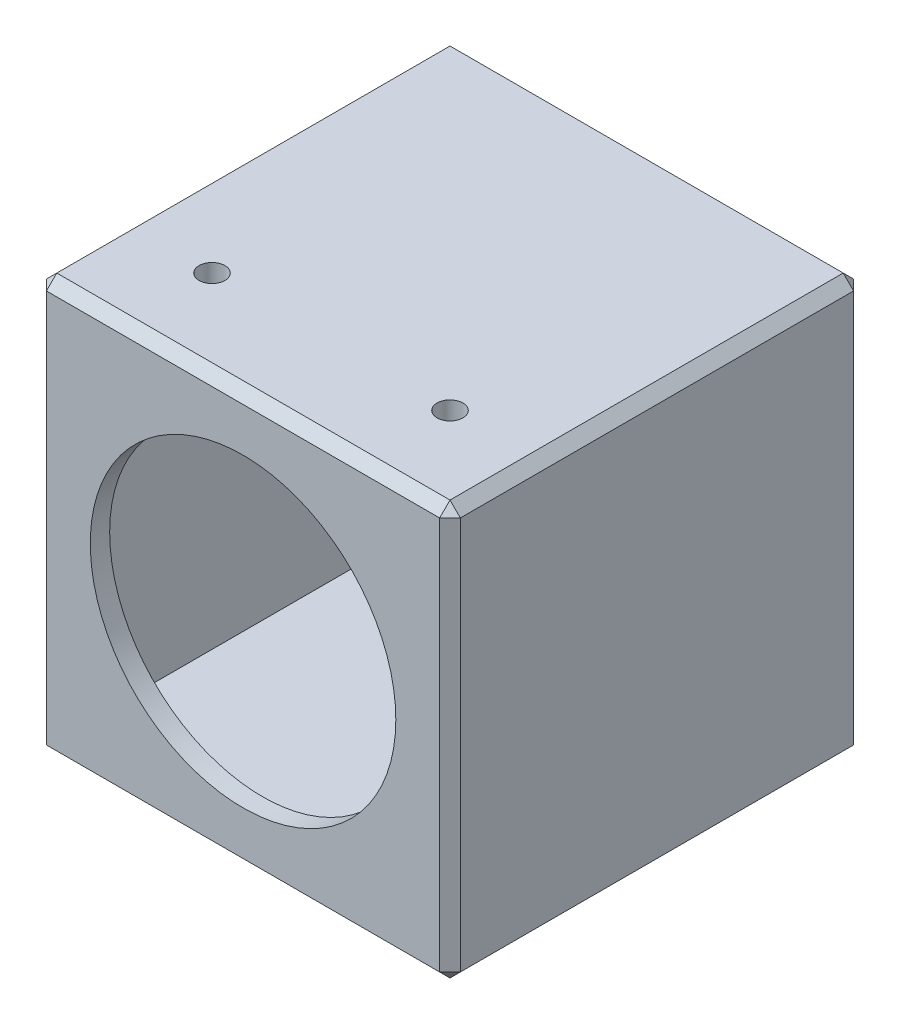
ISO-10303-21;
HEADER;
FILE_DESCRIPTION(('STEP AP214'),'2;1');
FILE_NAME('part.step','',(''),(''),'','','');
FILE_SCHEMA(('AUTOMOTIVE_DESIGN { 1 0 10303 214 1 1 1 1 }'));
ENDSEC;
DATA;
#1=APPLICATION_CONTEXT('core data for automotive mechanical design processes');
#2=APPLICATION_PROTOCOL_DEFINITION('international standard','automotive_design',2000,#1);
#3=PRODUCT_CONTEXT('',#1,'mechanical');
#4=PRODUCT('Part','Part','',(#3));
#5=PRODUCT_RELATED_PRODUCT_CATEGORY('part','',(#4));
#6=PRODUCT_DEFINITION_FORMATION('','',#4);
#7=PRODUCT_DEFINITION_CONTEXT('part definition',#1,'design');
#8=PRODUCT_DEFINITION('design','',#6,#7);
#9=PRODUCT_DEFINITION_SHAPE('','',#8);
#10=(LENGTH_UNIT() NAMED_UNIT(*) SI_UNIT(.MILLI.,.METRE.));
#11=(NAMED_UNIT(*) PLANE_ANGLE_UNIT() SI_UNIT($,.RADIAN.));
#12=(NAMED_UNIT(*) SI_UNIT($,.STERADIAN.) SOLID_ANGLE_UNIT());
#13=UNCERTAINTY_MEASURE_WITH_UNIT(LENGTH_MEASURE(1.E-05),#10,'distance_accuracy_value','');
#14=(GEOMETRIC_REPRESENTATION_CONTEXT(3) GLOBAL_UNCERTAINTY_ASSIGNED_CONTEXT((#13)) GLOBAL_UNIT_ASSIGNED_CONTEXT((#10,
#11,#12)) REPRESENTATION_CONTEXT('',''));
#15=CARTESIAN_POINT('',(0.,0.,0.));
#16=DIRECTION('',(0.,0.,1.));
#17=DIRECTION('',(1.,0.,0.));
#18=AXIS2_PLACEMENT_3D('',#15,#16,#17);
#19=CARTESIAN_POINT('',(-50.8,101.6,-50.8));
#20=DIRECTION('',(1.,0.,0.));
#21=DIRECTION('',(0.,0.,-1.));
#22=AXIS2_PLACEMENT_3D('',#19,#20,#21);
#23=PLANE('',#22);
#24=DIRECTION('',(0.,0.,-1.));
#25=VECTOR('',#24,1.);
#26=CARTESIAN_POINT('',(-50.8,99.06,-50.8));
#27=LINE('',#26,#25);
#28=CARTESIAN_POINT('',(-50.8,99.06,48.26));
#29=VERTEX_POINT('',#28);
#30=CARTESIAN_POINT('',(-50.8,99.06,-48.26));
#31=VERTEX_POINT('',#30);
#32=EDGE_CURVE('E229',#29,#31,#27,.T.);
#33=ORIENTED_EDGE('',*,*,#32,.T.);
#34=DIRECTION('',(0.,-1.,0.));
#35=VECTOR('',#34,1.);
#36=CARTESIAN_POINT('',(-50.8,101.6,-48.26));
#37=LINE('',#36,#35);
#38=CARTESIAN_POINT('',(-50.8,2.53999999999999,-48.26));
#39=VERTEX_POINT('',#38);
#40=EDGE_CURVE('E231',#31,#39,#37,.T.);
#41=ORIENTED_EDGE('',*,*,#40,.T.);
#42=DIRECTION('',(0.,0.,1.));
#43=VECTOR('',#42,1.);
#44=CARTESIAN_POINT('',(-50.8,2.53999999999999,-50.8));
#45=LINE('',#44,#43);
#46=CARTESIAN_POINT('',(-50.8,2.53999999999999,48.26));
#47=VERTEX_POINT('',#46);
#48=EDGE_CURVE('E225',#39,#47,#45,.T.);
#49=ORIENTED_EDGE('',*,*,#48,.T.);
#50=DIRECTION('',(0.,1.,0.));
#51=VECTOR('',#50,1.);
#52=CARTESIAN_POINT('',(-50.8,101.6,48.26));
#53=LINE('',#52,#51);
#54=EDGE_CURVE('E227',#47,#29,#53,.T.);
#55=ORIENTED_EDGE('',*,*,#54,.T.);
#56=EDGE_LOOP('',(#33,#41,#49,#55));
#57=FACE_BOUND('',#56,.T.);
#58=ADVANCED_FACE('F35',(#57),#23,.F.);
#59=CARTESIAN_POINT('',(-50.8,101.6,50.8));
#60=DIRECTION('',(0.,0.,-1.));
#61=DIRECTION('',(-1.,0.,0.));
#62=AXIS2_PLACEMENT_3D('',#59,#60,#61);
#63=PLANE('',#62);
#64=CARTESIAN_POINT('',(0.,50.8,50.8));
#65=DIRECTION('',(0.,0.,1.));
#66=DIRECTION('',(1.,0.,0.));
#67=AXIS2_PLACEMENT_3D('',#64,#65,#66);
#68=CIRCLE('',#67,37.5);
#69=CARTESIAN_POINT('',(37.5,50.8,50.8));
#70=VERTEX_POINT('',#69);
#71=EDGE_CURVE('E171',#70,#70,#68,.T.);
#72=ORIENTED_EDGE('',*,*,#71,.F.);
#73=EDGE_LOOP('',(#72));
#74=FACE_BOUND('',#73,.T.);
#75=DIRECTION('',(-1.,0.,0.));
#76=VECTOR('',#75,1.);
#77=CARTESIAN_POINT('',(-50.8,99.06,50.8));
#78=LINE('',#77,#76);
#79=CARTESIAN_POINT('',(48.26,99.06,50.8));
#80=VERTEX_POINT('',#79);
#81=CARTESIAN_POINT('',(-48.26,99.06,50.8));
#82=VERTEX_POINT('',#81);
#83=EDGE_CURVE('E167',#80,#82,#78,.T.);
#84=ORIENTED_EDGE('',*,*,#83,.T.);
#85=DIRECTION('',(0.,-1.,0.));
#86=VECTOR('',#85,1.);
#87=CARTESIAN_POINT('',(-48.26,101.6,50.8));
#88=LINE('',#87,#86);
#89=CARTESIAN_POINT('',(-48.26,2.53999999999999,50.8));
#90=VERTEX_POINT('',#89);
#91=EDGE_CURVE('E205',#82,#90,#88,.T.);
#92=ORIENTED_EDGE('',*,*,#91,.T.);
#93=DIRECTION('',(1.,0.,0.));
#94=VECTOR('',#93,1.);
#95=CARTESIAN_POINT('',(-50.8,2.53999999999999,50.8));
#96=LINE('',#95,#94);
#97=CARTESIAN_POINT('',(48.26,2.53999999999999,50.8));
#98=VERTEX_POINT('',#97);
#99=EDGE_CURVE('E202',#90,#98,#96,.T.);
#100=ORIENTED_EDGE('',*,*,#99,.T.);
#101=DIRECTION('',(0.,1.,0.));
#102=VECTOR('',#101,1.);
#103=CARTESIAN_POINT('',(48.26,101.6,50.8));
#104=LINE('',#103,#102);
#105=EDGE_CURVE('E197',#98,#80,#104,.T.);
#106=ORIENTED_EDGE('',*,*,#105,.T.);
#107=EDGE_LOOP('',(#84,#92,#100,#106));
#108=FACE_BOUND('',#107,.T.);
#109=ADVANCED_FACE('F342',(#74,#108),#63,.F.);
#110=CARTESIAN_POINT('',(50.8,101.6,-50.8));
#111=DIRECTION('',(-1.,0.,0.));
#112=DIRECTION('',(0.,0.,1.));
#113=AXIS2_PLACEMENT_3D('',#110,#111,#112);
#114=PLANE('',#113);
#115=DIRECTION('',(0.,0.,1.));
#116=VECTOR('',#115,1.);
#117=CARTESIAN_POINT('',(50.8,99.06,50.8));
#118=LINE('',#117,#116);
#119=CARTESIAN_POINT('',(50.8,99.06,-48.26));
#120=VERTEX_POINT('',#119);
#121=CARTESIAN_POINT('',(50.8,99.06,48.26));
#122=VERTEX_POINT('',#121);
#123=EDGE_CURVE('E86',#120,#122,#118,.T.);
#124=ORIENTED_EDGE('',*,*,#123,.T.);
#125=DIRECTION('',(0.,-1.,0.));
#126=VECTOR('',#125,1.);
#127=CARTESIAN_POINT('',(50.8,101.6,48.26));
#128=LINE('',#127,#126);
#129=CARTESIAN_POINT('',(50.8,2.53999999999999,48.26));
#130=VERTEX_POINT('',#129);
#131=EDGE_CURVE('E238',#122,#130,#128,.T.);
#132=ORIENTED_EDGE('',*,*,#131,.T.);
#133=DIRECTION('',(0.,0.,-1.));
#134=VECTOR('',#133,1.);
#135=CARTESIAN_POINT('',(50.8,2.53999999999999,-50.8));
#136=LINE('',#135,#134);
#137=CARTESIAN_POINT('',(50.8,2.53999999999999,-48.26));
#138=VERTEX_POINT('',#137);
#139=EDGE_CURVE('E234',#130,#138,#136,.T.);
#140=ORIENTED_EDGE('',*,*,#139,.T.);
#141=DIRECTION('',(0.,1.,0.));
#142=VECTOR('',#141,1.);
#143=CARTESIAN_POINT('',(50.8,101.6,-48.26));
#144=LINE('',#143,#142);
#145=EDGE_CURVE('E91',#138,#120,#144,.T.);
#146=ORIENTED_EDGE('',*,*,#145,.T.);
#147=EDGE_LOOP('',(#124,#132,#140,#146));
#148=FACE_BOUND('',#147,.T.);
#149=ADVANCED_FACE('F348',(#148),#114,.F.);
#150=CARTESIAN_POINT('',(-50.8,101.6,-50.8));
#151=DIRECTION('',(0.,0.,1.));
#152=DIRECTION('',(1.,0.,0.));
#153=AXIS2_PLACEMENT_3D('',#150,#151,#152);
#154=PLANE('',#153);
#155=DIRECTION('',(0.,1.,0.));
#156=VECTOR('',#155,1.);
#157=CARTESIAN_POINT('',(-48.26,101.6,-50.8));
#158=LINE('',#157,#156);
#159=CARTESIAN_POINT('',(-48.26,2.53999999999999,-50.8));
#160=VERTEX_POINT('',#159);
#161=CARTESIAN_POINT('',(-48.26,99.06,-50.8));
#162=VERTEX_POINT('',#161);
#163=EDGE_CURVE('E220',#160,#162,#158,.T.);
#164=ORIENTED_EDGE('',*,*,#163,.T.);
#165=DIRECTION('',(1.,0.,0.));
#166=VECTOR('',#165,1.);
#167=CARTESIAN_POINT('',(50.8,99.06,-50.8));
#168=LINE('',#167,#166);
#169=CARTESIAN_POINT('',(48.26,99.06,-50.8));
#170=VERTEX_POINT('',#169);
#171=EDGE_CURVE('E222',#162,#170,#168,.T.);
#172=ORIENTED_EDGE('',*,*,#171,.T.);
#173=DIRECTION('',(0.,-1.,0.));
#174=VECTOR('',#173,1.);
#175=CARTESIAN_POINT('',(48.26,101.6,-50.8));
#176=LINE('',#175,#174);
#177=CARTESIAN_POINT('',(48.26,2.53999999999999,-50.8));
#178=VERTEX_POINT('',#177);
#179=EDGE_CURVE('E216',#170,#178,#176,.T.);
#180=ORIENTED_EDGE('',*,*,#179,.T.);
#181=DIRECTION('',(-1.,0.,0.));
#182=VECTOR('',#181,1.);
#183=CARTESIAN_POINT('',(-50.8,2.53999999999999,-50.8));
#184=LINE('',#183,#182);
#185=EDGE_CURVE('E218',#178,#160,#184,.T.);
#186=ORIENTED_EDGE('',*,*,#185,.T.);
#187=EDGE_LOOP('',(#164,#172,#180,#186));
#188=FACE_BOUND('',#187,.T.);
#189=ADVANCED_FACE('F440',(#188),#154,.F.);
#190=CARTESIAN_POINT('',(0.,101.6,0.));
#191=DIRECTION('',(0.,1.,0.));
#192=DIRECTION('',(0.,0.,1.));
#193=AXIS2_PLACEMENT_3D('',#190,#191,#192);
#194=PLANE('',#193);
#195=CARTESIAN_POINT('',(29.21,101.6,29.21));
#196=DIRECTION('',(0.,1.,0.));
#197=DIRECTION('',(0.,0.,1.));
#198=AXIS2_PLACEMENT_3D('',#195,#196,#197);
#199=CIRCLE('',#198,3.175);
#200=CARTESIAN_POINT('',(29.21,101.6,32.385));
#201=VERTEX_POINT('',#200);
#202=EDGE_CURVE('E604',#201,#201,#199,.T.);
#203=ORIENTED_EDGE('',*,*,#202,.F.);
#204=EDGE_LOOP('',(#203));
#205=FACE_BOUND('',#204,.T.);
#206=CARTESIAN_POINT('',(-29.21,101.6,29.21));
#207=DIRECTION('',(0.,1.,0.));
#208=DIRECTION('',(0.,0.,1.));
#209=AXIS2_PLACEMENT_3D('',#206,#207,#208);
#210=CIRCLE('',#209,3.175);
#211=CARTESIAN_POINT('',(-29.21,101.6,32.385));
#212=VERTEX_POINT('',#211);
#213=EDGE_CURVE('E607',#212,#212,#210,.T.);
#214=ORIENTED_EDGE('',*,*,#213,.F.);
#215=EDGE_LOOP('',(#214));
#216=FACE_BOUND('',#215,.T.);
#217=DIRECTION('',(-1.,0.,0.));
#218=VECTOR('',#217,1.);
#219=CARTESIAN_POINT('',(-50.8,101.6,-48.26));
#220=LINE('',#219,#218);
#221=CARTESIAN_POINT('',(48.26,101.6,-48.26));
#222=VERTEX_POINT('',#221);
#223=CARTESIAN_POINT('',(-48.26,101.6,-48.26));
#224=VERTEX_POINT('',#223);
#225=EDGE_CURVE('E189',#222,#224,#220,.T.);
#226=ORIENTED_EDGE('',*,*,#225,.T.);
#227=DIRECTION('',(0.,0.,1.));
#228=VECTOR('',#227,1.);
#229=CARTESIAN_POINT('',(-48.26,101.6,50.8));
#230=LINE('',#229,#228);
#231=CARTESIAN_POINT('',(-48.26,101.6,48.26));
#232=VERTEX_POINT('',#231);
#233=EDGE_CURVE('E194',#224,#232,#230,.T.);
#234=ORIENTED_EDGE('',*,*,#233,.T.);
#235=DIRECTION('',(1.,0.,0.));
#236=VECTOR('',#235,1.);
#237=CARTESIAN_POINT('',(50.8,101.6,48.26));
#238=LINE('',#237,#236);
#239=CARTESIAN_POINT('',(48.26,101.6,48.26));
#240=VERTEX_POINT('',#239);
#241=EDGE_CURVE('E165',#232,#240,#238,.T.);
#242=ORIENTED_EDGE('',*,*,#241,.T.);
#243=DIRECTION('',(0.,0.,-1.));
#244=VECTOR('',#243,1.);
#245=CARTESIAN_POINT('',(48.26,101.6,-50.8));
#246=LINE('',#245,#244);
#247=EDGE_CURVE('E183',#240,#222,#246,.T.);
#248=ORIENTED_EDGE('',*,*,#247,.T.);
#249=EDGE_LOOP('',(#226,#234,#242,#248));
#250=FACE_BOUND('',#249,.T.);
#251=ADVANCED_FACE('F192',(#205,#216,#250),#194,.T.);
#252=CARTESIAN_POINT('',(0.,0.,0.));
#253=DIRECTION('',(0.,1.,0.));
#254=DIRECTION('',(0.,0.,1.));
#255=AXIS2_PLACEMENT_3D('',#252,#253,#254);
#256=PLANE('',#255);
#257=DIRECTION('',(0.,0.,1.));
#258=VECTOR('',#257,1.);
#259=CARTESIAN_POINT('',(48.26,0.,0.));
#260=LINE('',#259,#258);
#261=CARTESIAN_POINT('',(48.26,0.,-48.26));
#262=VERTEX_POINT('',#261);
#263=CARTESIAN_POINT('',(48.26,0.,48.26));
#264=VERTEX_POINT('',#263);
#265=EDGE_CURVE('E207',#262,#264,#260,.T.);
#266=ORIENTED_EDGE('',*,*,#265,.T.);
#267=DIRECTION('',(-1.,0.,0.));
#268=VECTOR('',#267,1.);
#269=CARTESIAN_POINT('',(0.,0.,48.26));
#270=LINE('',#269,#268);
#271=CARTESIAN_POINT('',(-48.26,0.,48.26));
#272=VERTEX_POINT('',#271);
#273=EDGE_CURVE('E213',#264,#272,#270,.T.);
#274=ORIENTED_EDGE('',*,*,#273,.T.);
#275=DIRECTION('',(0.,0.,-1.));
#276=VECTOR('',#275,1.);
#277=CARTESIAN_POINT('',(-48.26,0.,0.));
#278=LINE('',#277,#276);
#279=CARTESIAN_POINT('',(-48.26,0.,-48.26));
#280=VERTEX_POINT('',#279);
#281=EDGE_CURVE('E211',#272,#280,#278,.T.);
#282=ORIENTED_EDGE('',*,*,#281,.T.);
#283=DIRECTION('',(1.,0.,0.));
#284=VECTOR('',#283,1.);
#285=CARTESIAN_POINT('',(0.,0.,-48.26));
#286=LINE('',#285,#284);
#287=EDGE_CURVE('E209',#280,#262,#286,.T.);
#288=ORIENTED_EDGE('',*,*,#287,.T.);
#289=EDGE_LOOP('',(#266,#274,#282,#288));
#290=FACE_BOUND('',#289,.T.);
#291=ADVANCED_FACE('F427',(#290),#256,.F.);
#292=CARTESIAN_POINT('',(-50.8,2.53999999999999,-50.8));
#293=DIRECTION('',(0.,0.707106781186549,0.707106781186546));
#294=DIRECTION('',(-1.,0.,0.));
#295=AXIS2_PLACEMENT_3D('',#292,#293,#294);
#296=PLANE('',#295);
#297=DIRECTION('',(0.,0.707106781186546,-0.707106781186549));
#298=VECTOR('',#297,1.);
#299=CARTESIAN_POINT('',(-48.26,1.26999999999999,-49.53));
#300=LINE('',#299,#298);
#301=EDGE_CURVE('E190',#160,#280,#300,.F.);
#302=ORIENTED_EDGE('',*,*,#301,.F.);
#303=ORIENTED_EDGE('',*,*,#185,.F.);
#304=DIRECTION('',(0.,-0.707106781186546,0.707106781186549));
#305=VECTOR('',#304,1.);
#306=CARTESIAN_POINT('',(48.26,0.,-48.26));
#307=LINE('',#306,#305);
#308=EDGE_CURVE('E290',#262,#178,#307,.F.);
#309=ORIENTED_EDGE('',*,*,#308,.F.);
#310=ORIENTED_EDGE('',*,*,#287,.F.);
#311=EDGE_LOOP('',(#302,#303,#309,#310));
#312=FACE_BOUND('',#311,.T.);
#313=ADVANCED_FACE('F423',(#312),#296,.F.);
#314=CARTESIAN_POINT('',(-50.8,2.53999999999999,-48.26));
#315=DIRECTION('',(-0.577350269189623,-0.577350269189628,-0.577350269189626));
#316=DIRECTION('',(0.,0.707106781186547,-0.707106781186548));
#317=AXIS2_PLACEMENT_3D('',#314,#315,#316);
#318=PLANE('',#317);
#319=DIRECTION('',(-0.707106781186549,0.,0.707106781186546));
#320=VECTOR('',#319,1.);
#321=CARTESIAN_POINT('',(-50.8,2.53999999999999,-48.26));
#322=LINE('',#321,#320);
#323=EDGE_CURVE('E284',#160,#39,#322,.T.);
#324=ORIENTED_EDGE('',*,*,#323,.F.);
#325=ORIENTED_EDGE('',*,*,#301,.T.);
#326=DIRECTION('',(0.707106781186549,-0.707106781186546,0.));
#327=VECTOR('',#326,1.);
#328=CARTESIAN_POINT('',(-50.8,2.53999999999999,-48.26));
#329=LINE('',#328,#327);
#330=EDGE_CURVE('E287',#39,#280,#329,.T.);
#331=ORIENTED_EDGE('',*,*,#330,.F.);
#332=EDGE_LOOP('',(#324,#325,#331));
#333=FACE_BOUND('',#332,.T.);
#334=ADVANCED_FACE('F419',(#333),#318,.T.);
#335=CARTESIAN_POINT('',(48.26,0.,-48.26));
#336=DIRECTION('',(0.577350269189623,-0.577350269189629,-0.577350269189626));
#337=DIRECTION('',(0.,0.707106781186546,-0.707106781186549));
#338=AXIS2_PLACEMENT_3D('',#335,#336,#337);
#339=PLANE('',#338);
#340=DIRECTION('',(0.707106781186549,0.707106781186546,0.));
#341=VECTOR('',#340,1.);
#342=CARTESIAN_POINT('',(48.26,0.,-48.26));
#343=LINE('',#342,#341);
#344=EDGE_CURVE('E278',#262,#138,#343,.T.);
#345=ORIENTED_EDGE('',*,*,#344,.F.);
#346=ORIENTED_EDGE('',*,*,#308,.T.);
#347=DIRECTION('',(-0.707106781186549,0.,-0.707106781186545));
#348=VECTOR('',#347,1.);
#349=CARTESIAN_POINT('',(49.53,2.53999999999999,-49.53));
#350=LINE('',#349,#348);
#351=EDGE_CURVE('E281',#138,#178,#350,.T.);
#352=ORIENTED_EDGE('',*,*,#351,.F.);
#353=EDGE_LOOP('',(#345,#346,#352));
#354=FACE_BOUND('',#353,.T.);
#355=ADVANCED_FACE('F415',(#354),#339,.T.);
#356=CARTESIAN_POINT('',(-50.8,2.53999999999999,-50.8));
#357=DIRECTION('',(0.707106781186546,0.707106781186549,0.));
#358=DIRECTION('',(0.,0.,1.));
#359=AXIS2_PLACEMENT_3D('',#356,#357,#358);
#360=PLANE('',#359);
#361=ORIENTED_EDGE('',*,*,#330,.T.);
#362=ORIENTED_EDGE('',*,*,#281,.F.);
#363=DIRECTION('',(-0.707106781186549,0.707106781186546,0.));
#364=VECTOR('',#363,1.);
#365=CARTESIAN_POINT('',(-48.26,0.,48.26));
#366=LINE('',#365,#364);
#367=EDGE_CURVE('E273',#47,#272,#366,.F.);
#368=ORIENTED_EDGE('',*,*,#367,.F.);
#369=ORIENTED_EDGE('',*,*,#48,.F.);
#370=EDGE_LOOP('',(#361,#362,#368,#369));
#371=FACE_BOUND('',#370,.T.);
#372=ADVANCED_FACE('F411',(#371),#360,.F.);
#373=CARTESIAN_POINT('',(-50.8,101.6,-48.26));
#374=DIRECTION('',(0.707106781186546,0.,0.707106781186549));
#375=DIRECTION('',(0.,-1.,0.));
#376=AXIS2_PLACEMENT_3D('',#373,#374,#375);
#377=PLANE('',#376);
#378=ORIENTED_EDGE('',*,*,#323,.T.);
#379=ORIENTED_EDGE('',*,*,#40,.F.);
#380=DIRECTION('',(0.70710678118655,0.,-0.707106781186546));
#381=VECTOR('',#380,1.);
#382=CARTESIAN_POINT('',(-49.53,99.06,-49.53));
#383=LINE('',#382,#381);
#384=EDGE_CURVE('E270',#162,#31,#383,.F.);
#385=ORIENTED_EDGE('',*,*,#384,.F.);
#386=ORIENTED_EDGE('',*,*,#163,.F.);
#387=EDGE_LOOP('',(#378,#379,#385,#386));
#388=FACE_BOUND('',#387,.T.);
#389=ADVANCED_FACE('F407',(#388),#377,.F.);
#390=CARTESIAN_POINT('',(0.,101.6,-48.26));
#391=DIRECTION('',(0.,0.707106781186546,-0.707106781186549));
#392=DIRECTION('',(1.,0.,0.));
#393=AXIS2_PLACEMENT_3D('',#390,#391,#392);
#394=PLANE('',#393);
#395=DIRECTION('',(0.,0.707106781186549,0.707106781186546));
#396=VECTOR('',#395,1.);
#397=CARTESIAN_POINT('',(48.26,99.06,-50.8));
#398=LINE('',#397,#396);
#399=EDGE_CURVE('E264',#170,#222,#398,.T.);
#400=ORIENTED_EDGE('',*,*,#399,.F.);
#401=ORIENTED_EDGE('',*,*,#171,.F.);
#402=DIRECTION('',(0.,-0.707106781186549,-0.707106781186546));
#403=VECTOR('',#402,1.);
#404=CARTESIAN_POINT('',(-48.26,101.6,-48.26));
#405=LINE('',#404,#403);
#406=EDGE_CURVE('E267',#224,#162,#405,.T.);
#407=ORIENTED_EDGE('',*,*,#406,.F.);
#408=ORIENTED_EDGE('',*,*,#225,.F.);
#409=EDGE_LOOP('',(#400,#401,#407,#408));
#410=FACE_BOUND('',#409,.T.);
#411=ADVANCED_FACE('F403',(#410),#394,.T.);
#412=CARTESIAN_POINT('',(48.26,101.6,-50.8));
#413=DIRECTION('',(-0.707106781186546,0.,0.707106781186549));
#414=DIRECTION('',(0.,-1.,0.));
#415=AXIS2_PLACEMENT_3D('',#412,#413,#414);
#416=PLANE('',#415);
#417=ORIENTED_EDGE('',*,*,#351,.T.);
#418=ORIENTED_EDGE('',*,*,#179,.F.);
#419=DIRECTION('',(0.707106781186549,0.,0.707106781186546));
#420=VECTOR('',#419,1.);
#421=CARTESIAN_POINT('',(48.26,99.06,-50.8));
#422=LINE('',#421,#420);
#423=EDGE_CURVE('E262',#120,#170,#422,.F.);
#424=ORIENTED_EDGE('',*,*,#423,.F.);
#425=ORIENTED_EDGE('',*,*,#145,.F.);
#426=EDGE_LOOP('',(#417,#418,#424,#425));
#427=FACE_BOUND('',#426,.T.);
#428=ADVANCED_FACE('F399',(#427),#416,.F.);
#429=CARTESIAN_POINT('',(50.8,2.53999999999999,-50.8));
#430=DIRECTION('',(-0.707106781186546,0.707106781186549,0.));
#431=DIRECTION('',(0.,0.,-1.));
#432=AXIS2_PLACEMENT_3D('',#429,#430,#431);
#433=PLANE('',#432);
#434=ORIENTED_EDGE('',*,*,#344,.T.);
#435=ORIENTED_EDGE('',*,*,#139,.F.);
#436=DIRECTION('',(-0.707106781186549,-0.707106781186546,0.));
#437=VECTOR('',#436,1.);
#438=CARTESIAN_POINT('',(49.53,1.26999999999999,48.26));
#439=LINE('',#438,#437);
#440=EDGE_CURVE('E259',#264,#130,#439,.F.);
#441=ORIENTED_EDGE('',*,*,#440,.F.);
#442=ORIENTED_EDGE('',*,*,#265,.F.);
#443=EDGE_LOOP('',(#434,#435,#441,#442));
#444=FACE_BOUND('',#443,.T.);
#445=ADVANCED_FACE('F395',(#444),#433,.F.);
#446=CARTESIAN_POINT('',(-50.8,2.53999999999999,50.8));
#447=DIRECTION('',(0.,0.707106781186549,-0.707106781186546));
#448=DIRECTION('',(1.,0.,0.));
#449=AXIS2_PLACEMENT_3D('',#446,#447,#448);
#450=PLANE('',#449);
#451=DIRECTION('',(0.,-0.707106781186546,-0.707106781186549));
#452=VECTOR('',#451,1.);
#453=CARTESIAN_POINT('',(-48.26,0.,48.26));
#454=LINE('',#453,#452);
#455=EDGE_CURVE('E275',#272,#90,#454,.F.);
#456=ORIENTED_EDGE('',*,*,#455,.F.);
#457=ORIENTED_EDGE('',*,*,#273,.F.);
#458=DIRECTION('',(0.,0.707106781186546,0.707106781186549));
#459=VECTOR('',#458,1.);
#460=CARTESIAN_POINT('',(48.26,2.53999999999999,50.8));
#461=LINE('',#460,#459);
#462=EDGE_CURVE('E256',#98,#264,#461,.F.);
#463=ORIENTED_EDGE('',*,*,#462,.F.);
#464=ORIENTED_EDGE('',*,*,#99,.F.);
#465=EDGE_LOOP('',(#456,#457,#463,#464));
#466=FACE_BOUND('',#465,.T.);
#467=ADVANCED_FACE('F391',(#466),#450,.F.);
#468=CARTESIAN_POINT('',(-48.26,0.,48.26));
#469=DIRECTION('',(-0.577350269189626,-0.577350269189628,0.577350269189623));
#470=DIRECTION('',(0.707106781186548,-0.707106781186547,0.));
#471=AXIS2_PLACEMENT_3D('',#468,#469,#470);
#472=PLANE('',#471);
#473=ORIENTED_EDGE('',*,*,#367,.T.);
#474=ORIENTED_EDGE('',*,*,#455,.T.);
#475=DIRECTION('',(0.707106781186546,0.,0.707106781186549));
#476=VECTOR('',#475,1.);
#477=CARTESIAN_POINT('',(-49.53,2.53999999999999,49.53));
#478=LINE('',#477,#476);
#479=EDGE_CURVE('E253',#47,#90,#478,.T.);
#480=ORIENTED_EDGE('',*,*,#479,.F.);
#481=EDGE_LOOP('',(#473,#474,#480));
#482=FACE_BOUND('',#481,.T.);
#483=ADVANCED_FACE('F387',(#482),#472,.T.);
#484=CARTESIAN_POINT('',(-48.26,101.6,-48.26));
#485=DIRECTION('',(-0.577350269189626,0.577350269189622,-0.57735026918963));
#486=DIRECTION('',(-0.707106781186549,0.,0.707106781186546));
#487=AXIS2_PLACEMENT_3D('',#484,#485,#486);
#488=PLANE('',#487);
#489=ORIENTED_EDGE('',*,*,#406,.T.);
#490=ORIENTED_EDGE('',*,*,#384,.T.);
#491=DIRECTION('',(0.707106781186545,0.70710678118655,0.));
#492=VECTOR('',#491,1.);
#493=CARTESIAN_POINT('',(-48.26,101.6,-48.26));
#494=LINE('',#493,#492);
#495=EDGE_CURVE('E250',#224,#31,#494,.F.);
#496=ORIENTED_EDGE('',*,*,#495,.F.);
#497=EDGE_LOOP('',(#489,#490,#496));
#498=FACE_BOUND('',#497,.T.);
#499=ADVANCED_FACE('F383',(#498),#488,.T.);
#500=CARTESIAN_POINT('',(48.26,99.06,-50.8));
#501=DIRECTION('',(0.577350269189623,0.577350269189626,-0.577350269189629));
#502=DIRECTION('',(0.,0.707106781186549,0.707106781186546));
#503=AXIS2_PLACEMENT_3D('',#500,#501,#502);
#504=PLANE('',#503);
#505=ORIENTED_EDGE('',*,*,#423,.T.);
#506=ORIENTED_EDGE('',*,*,#399,.T.);
#507=DIRECTION('',(0.707106781186549,-0.707106781186545,0.));
#508=VECTOR('',#507,1.);
#509=CARTESIAN_POINT('',(49.53,100.33,-48.26));
#510=LINE('',#509,#508);
#511=EDGE_CURVE('E186',#120,#222,#510,.F.);
#512=ORIENTED_EDGE('',*,*,#511,.F.);
#513=EDGE_LOOP('',(#505,#506,#512));
#514=FACE_BOUND('',#513,.T.);
#515=ADVANCED_FACE('F379',(#514),#504,.T.);
#516=CARTESIAN_POINT('',(48.26,2.53999999999999,50.8));
#517=DIRECTION('',(0.577350269189622,-0.577350269189628,0.577350269189627));
#518=DIRECTION('',(0.,-0.707106781186546,-0.707106781186548));
#519=AXIS2_PLACEMENT_3D('',#516,#517,#518);
#520=PLANE('',#519);
#521=ORIENTED_EDGE('',*,*,#462,.T.);
#522=ORIENTED_EDGE('',*,*,#440,.T.);
#523=DIRECTION('',(0.70710678118655,0.,-0.707106781186545));
#524=VECTOR('',#523,1.);
#525=CARTESIAN_POINT('',(48.26,2.53999999999999,50.8));
#526=LINE('',#525,#524);
#527=EDGE_CURVE('E247',#98,#130,#526,.T.);
#528=ORIENTED_EDGE('',*,*,#527,.F.);
#529=EDGE_LOOP('',(#521,#522,#528));
#530=FACE_BOUND('',#529,.T.);
#531=ADVANCED_FACE('F375',(#530),#520,.T.);
#532=CARTESIAN_POINT('',(-48.26,101.6,50.8));
#533=DIRECTION('',(0.707106781186549,0.,-0.707106781186546));
#534=DIRECTION('',(0.,-1.,0.));
#535=AXIS2_PLACEMENT_3D('',#532,#533,#534);
#536=PLANE('',#535);
#537=ORIENTED_EDGE('',*,*,#479,.T.);
#538=ORIENTED_EDGE('',*,*,#91,.F.);
#539=DIRECTION('',(-0.707106781186546,0.,-0.70710678118655));
#540=VECTOR('',#539,1.);
#541=CARTESIAN_POINT('',(-48.26,99.06,50.8));
#542=LINE('',#541,#540);
#543=EDGE_CURVE('E244',#29,#82,#542,.F.);
#544=ORIENTED_EDGE('',*,*,#543,.F.);
#545=ORIENTED_EDGE('',*,*,#54,.F.);
#546=EDGE_LOOP('',(#537,#538,#544,#545));
#547=FACE_BOUND('',#546,.T.);
#548=ADVANCED_FACE('F371',(#547),#536,.F.);
#549=CARTESIAN_POINT('',(-48.26,101.6,0.));
#550=DIRECTION('',(-0.70710678118655,0.707106781186545,0.));
#551=DIRECTION('',(0.,0.,-1.));
#552=AXIS2_PLACEMENT_3D('',#549,#550,#551);
#553=PLANE('',#552);
#554=ORIENTED_EDGE('',*,*,#495,.T.);
#555=ORIENTED_EDGE('',*,*,#32,.F.);
#556=DIRECTION('',(-0.707106781186545,-0.70710678118655,0.));
#557=VECTOR('',#556,1.);
#558=CARTESIAN_POINT('',(-49.53,100.33,48.26));
#559=LINE('',#558,#557);
#560=EDGE_CURVE('E180',#232,#29,#559,.T.);
#561=ORIENTED_EDGE('',*,*,#560,.F.);
#562=ORIENTED_EDGE('',*,*,#233,.F.);
#563=EDGE_LOOP('',(#554,#555,#561,#562));
#564=FACE_BOUND('',#563,.T.);
#565=ADVANCED_FACE('F368',(#564),#553,.T.);
#566=CARTESIAN_POINT('',(48.26,101.6,0.));
#567=DIRECTION('',(0.707106781186546,0.707106781186549,0.));
#568=DIRECTION('',(0.,0.,1.));
#569=AXIS2_PLACEMENT_3D('',#566,#567,#568);
#570=PLANE('',#569);
#571=ORIENTED_EDGE('',*,*,#511,.T.);
#572=ORIENTED_EDGE('',*,*,#247,.F.);
#573=DIRECTION('',(-0.707106781186549,0.707106781186546,0.));
#574=VECTOR('',#573,1.);
#575=CARTESIAN_POINT('',(48.26,101.6,48.26));
#576=LINE('',#575,#574);
#577=EDGE_CURVE('E174',#122,#240,#576,.T.);
#578=ORIENTED_EDGE('',*,*,#577,.F.);
#579=ORIENTED_EDGE('',*,*,#123,.F.);
#580=EDGE_LOOP('',(#571,#572,#578,#579));
#581=FACE_BOUND('',#580,.T.);
#582=ADVANCED_FACE('F184',(#581),#570,.T.);
#583=CARTESIAN_POINT('',(50.8,101.6,48.26));
#584=DIRECTION('',(-0.707106781186545,0.,-0.70710678118655));
#585=DIRECTION('',(0.,-1.,0.));
#586=AXIS2_PLACEMENT_3D('',#583,#584,#585);
#587=PLANE('',#586);
#588=ORIENTED_EDGE('',*,*,#527,.T.);
#589=ORIENTED_EDGE('',*,*,#131,.F.);
#590=DIRECTION('',(-0.70710678118655,0.,0.707106781186545));
#591=VECTOR('',#590,1.);
#592=CARTESIAN_POINT('',(49.53,99.06,49.53));
#593=LINE('',#592,#591);
#594=EDGE_CURVE('E178',#80,#122,#593,.F.);
#595=ORIENTED_EDGE('',*,*,#594,.F.);
#596=ORIENTED_EDGE('',*,*,#105,.F.);
#597=EDGE_LOOP('',(#588,#589,#595,#596));
#598=FACE_BOUND('',#597,.T.);
#599=ADVANCED_FACE('F361',(#598),#587,.F.);
#600=CARTESIAN_POINT('',(-48.26,99.06,50.8));
#601=DIRECTION('',(-0.57735026918963,0.577350269189622,0.577350269189626));
#602=DIRECTION('',(0.707106781186546,0.,0.707106781186549));
#603=AXIS2_PLACEMENT_3D('',#600,#601,#602);
#604=PLANE('',#603);
#605=ORIENTED_EDGE('',*,*,#560,.T.);
#606=ORIENTED_EDGE('',*,*,#543,.T.);
#607=DIRECTION('',(0.,0.70710678118655,-0.707106781186546));
#608=VECTOR('',#607,1.);
#609=CARTESIAN_POINT('',(-48.26,99.06,50.8));
#610=LINE('',#609,#608);
#611=EDGE_CURVE('E170',#232,#82,#610,.F.);
#612=ORIENTED_EDGE('',*,*,#611,.F.);
#613=EDGE_LOOP('',(#605,#606,#612));
#614=FACE_BOUND('',#613,.T.);
#615=ADVANCED_FACE('F358',(#614),#604,.T.);
#616=CARTESIAN_POINT('',(48.26,101.6,48.26));
#617=DIRECTION('',(0.577350269189622,0.577350269189625,0.57735026918963));
#618=DIRECTION('',(0.,-0.707106781186551,0.707106781186545));
#619=AXIS2_PLACEMENT_3D('',#616,#617,#618);
#620=PLANE('',#619);
#621=ORIENTED_EDGE('',*,*,#594,.T.);
#622=ORIENTED_EDGE('',*,*,#577,.T.);
#623=DIRECTION('',(0.,-0.707106781186549,0.707106781186546));
#624=VECTOR('',#623,1.);
#625=CARTESIAN_POINT('',(48.26,101.6,48.26));
#626=LINE('',#625,#624);
#627=EDGE_CURVE('E161',#80,#240,#626,.F.);
#628=ORIENTED_EDGE('',*,*,#627,.F.);
#629=EDGE_LOOP('',(#621,#622,#628));
#630=FACE_BOUND('',#629,.T.);
#631=ADVANCED_FACE('F176',(#630),#620,.T.);
#632=CARTESIAN_POINT('',(0.,101.6,48.26));
#633=DIRECTION('',(0.,0.707106781186546,0.707106781186549));
#634=DIRECTION('',(-1.,0.,0.));
#635=AXIS2_PLACEMENT_3D('',#632,#633,#634);
#636=PLANE('',#635);
#637=ORIENTED_EDGE('',*,*,#611,.T.);
#638=ORIENTED_EDGE('',*,*,#83,.F.);
#639=ORIENTED_EDGE('',*,*,#627,.T.);
#640=ORIENTED_EDGE('',*,*,#241,.F.);
#641=EDGE_LOOP('',(#637,#638,#639,#640));
#642=FACE_BOUND('',#641,.T.);
#643=ADVANCED_FACE('F163',(#642),#636,.T.);
#644=CARTESIAN_POINT('',(0.,50.8,-50.801));
#645=DIRECTION('',(0.,0.,1.));
#646=DIRECTION('',(1.,0.,0.));
#647=AXIS2_PLACEMENT_3D('',#644,#645,#646);
#648=CYLINDRICAL_SURFACE('',#647,37.5);
#649=CARTESIAN_POINT('',(0.,50.8,46.0375));
#650=DIRECTION('',(0.,0.,-1.));
#651=DIRECTION('',(-1.,0.,0.));
#652=AXIS2_PLACEMENT_3D('',#649,#650,#651);
#653=CIRCLE('',#652,37.5);
#654=CARTESIAN_POINT('',(-37.5,50.8,46.0375));
#655=VERTEX_POINT('',#654);
#656=EDGE_CURVE('E616',#655,#655,#653,.F.);
#657=ORIENTED_EDGE('',*,*,#656,.F.);
#658=EDGE_LOOP('',(#657));
#659=FACE_BOUND('',#658,.T.);
#660=ORIENTED_EDGE('',*,*,#71,.T.);
#661=EDGE_LOOP('',(#660));
#662=FACE_BOUND('',#661,.T.);
#663=ADVANCED_FACE('F355',(#659,#662),#648,.F.);
#664=CARTESIAN_POINT('',(0.,4.7625,0.));
#665=DIRECTION('',(0.,1.,0.));
#666=DIRECTION('',(0.,0.,1.));
#667=AXIS2_PLACEMENT_3D('',#664,#665,#666);
#668=PLANE('',#667);
#669=DIRECTION('',(1.,0.,0.));
#670=VECTOR('',#669,1.);
#671=CARTESIAN_POINT('',(-50.8,4.7625,46.0375));
#672=LINE('',#671,#670);
#673=CARTESIAN_POINT('',(-46.0375,4.7625,46.0375));
#674=VERTEX_POINT('',#673);
#675=CARTESIAN_POINT('',(46.0375,4.7625,46.0375));
#676=VERTEX_POINT('',#675);
#677=EDGE_CURVE('E39',#674,#676,#672,.T.);
#678=ORIENTED_EDGE('',*,*,#677,.T.);
#679=DIRECTION('',(0.,0.,-1.));
#680=VECTOR('',#679,1.);
#681=CARTESIAN_POINT('',(46.0375,4.7625,-50.8));
#682=LINE('',#681,#680);
#683=CARTESIAN_POINT('',(46.0375,4.7625,-46.0375));
#684=VERTEX_POINT('',#683);
#685=EDGE_CURVE('E309',#676,#684,#682,.T.);
#686=ORIENTED_EDGE('',*,*,#685,.T.);
#687=DIRECTION('',(-1.,0.,0.));
#688=VECTOR('',#687,1.);
#689=CARTESIAN_POINT('',(-50.8,4.7625,-46.0375));
#690=LINE('',#689,#688);
#691=CARTESIAN_POINT('',(-46.0375,4.7625,-46.0375));
#692=VERTEX_POINT('',#691);
#693=EDGE_CURVE('E304',#684,#692,#690,.T.);
#694=ORIENTED_EDGE('',*,*,#693,.T.);
#695=DIRECTION('',(0.,0.,1.));
#696=VECTOR('',#695,1.);
#697=CARTESIAN_POINT('',(-46.0375,4.7625,-50.8));
#698=LINE('',#697,#696);
#699=EDGE_CURVE('E78',#692,#674,#698,.T.);
#700=ORIENTED_EDGE('',*,*,#699,.T.);
#701=EDGE_LOOP('',(#678,#686,#694,#700));
#702=FACE_BOUND('',#701,.T.);
#703=ADVANCED_FACE('F318',(#702),#668,.T.);
#704=CARTESIAN_POINT('',(-50.8,101.6,46.0375));
#705=DIRECTION('',(0.,0.,-1.));
#706=DIRECTION('',(-1.,0.,0.));
#707=AXIS2_PLACEMENT_3D('',#704,#705,#706);
#708=PLANE('',#707);
#709=ORIENTED_EDGE('',*,*,#656,.T.);
#710=EDGE_LOOP('',(#709));
#711=FACE_BOUND('',#710,.T.);
#712=DIRECTION('',(0.,1.,0.));
#713=VECTOR('',#712,1.);
#714=CARTESIAN_POINT('',(-46.0375,101.6,46.0375));
#715=LINE('',#714,#713);
#716=CARTESIAN_POINT('',(-46.0375,96.8375,46.0375));
#717=VERTEX_POINT('',#716);
#718=EDGE_CURVE('E75',#674,#717,#715,.T.);
#719=ORIENTED_EDGE('',*,*,#718,.T.);
#720=DIRECTION('',(-1.,0.,0.));
#721=VECTOR('',#720,1.);
#722=CARTESIAN_POINT('',(0.,96.8375,46.0375));
#723=LINE('',#722,#721);
#724=CARTESIAN_POINT('',(46.0375,96.8375,46.0375));
#725=VERTEX_POINT('',#724);
#726=EDGE_CURVE('E313',#725,#717,#723,.T.);
#727=ORIENTED_EDGE('',*,*,#726,.F.);
#728=DIRECTION('',(0.,-1.,0.));
#729=VECTOR('',#728,1.);
#730=CARTESIAN_POINT('',(46.0375,101.6,46.0375));
#731=LINE('',#730,#729);
#732=EDGE_CURVE('E311',#725,#676,#731,.T.);
#733=ORIENTED_EDGE('',*,*,#732,.T.);
#734=ORIENTED_EDGE('',*,*,#677,.F.);
#735=EDGE_LOOP('',(#719,#727,#733,#734));
#736=FACE_BOUND('',#735,.T.);
#737=ADVANCED_FACE('F322',(#711,#736),#708,.T.);
#738=CARTESIAN_POINT('',(46.0375,101.6,-50.8));
#739=DIRECTION('',(-1.,0.,0.));
#740=DIRECTION('',(0.,0.,1.));
#741=AXIS2_PLACEMENT_3D('',#738,#739,#740);
#742=PLANE('',#741);
#743=ORIENTED_EDGE('',*,*,#732,.F.);
#744=DIRECTION('',(0.,0.,-1.));
#745=VECTOR('',#744,1.);
#746=CARTESIAN_POINT('',(46.0375,96.8375,-50.8));
#747=LINE('',#746,#745);
#748=CARTESIAN_POINT('',(46.0375,96.8375,-46.0375));
#749=VERTEX_POINT('',#748);
#750=EDGE_CURVE('E45',#725,#749,#747,.T.);
#751=ORIENTED_EDGE('',*,*,#750,.T.);
#752=DIRECTION('',(0.,-1.,0.));
#753=VECTOR('',#752,1.);
#754=CARTESIAN_POINT('',(46.0375,101.6,-46.0375));
#755=LINE('',#754,#753);
#756=EDGE_CURVE('E306',#749,#684,#755,.T.);
#757=ORIENTED_EDGE('',*,*,#756,.T.);
#758=ORIENTED_EDGE('',*,*,#685,.F.);
#759=EDGE_LOOP('',(#743,#751,#757,#758));
#760=FACE_BOUND('',#759,.T.);
#761=ADVANCED_FACE('F324',(#760),#742,.T.);
#762=CARTESIAN_POINT('',(-50.8,101.6,-46.0375));
#763=DIRECTION('',(0.,0.,1.));
#764=DIRECTION('',(1.,0.,0.));
#765=AXIS2_PLACEMENT_3D('',#762,#763,#764);
#766=PLANE('',#765);
#767=DIRECTION('',(0.,-1.,0.));
#768=VECTOR('',#767,1.);
#769=CARTESIAN_POINT('',(-46.0375,101.6,-46.0375));
#770=LINE('',#769,#768);
#771=CARTESIAN_POINT('',(-46.0375,96.8375,-46.0375));
#772=VERTEX_POINT('',#771);
#773=EDGE_CURVE('E299',#772,#692,#770,.T.);
#774=ORIENTED_EDGE('',*,*,#773,.T.);
#775=ORIENTED_EDGE('',*,*,#693,.F.);
#776=ORIENTED_EDGE('',*,*,#756,.F.);
#777=DIRECTION('',(-1.,0.,0.));
#778=VECTOR('',#777,1.);
#779=CARTESIAN_POINT('',(-50.8,96.8375,-46.0375));
#780=LINE('',#779,#778);
#781=EDGE_CURVE('E11',#749,#772,#780,.T.);
#782=ORIENTED_EDGE('',*,*,#781,.T.);
#783=EDGE_LOOP('',(#774,#775,#776,#782));
#784=FACE_BOUND('',#783,.T.);
#785=ADVANCED_FACE('F326',(#784),#766,.T.);
#786=CARTESIAN_POINT('',(-46.0375,101.6,-50.8));
#787=DIRECTION('',(1.,0.,0.));
#788=DIRECTION('',(0.,0.,-1.));
#789=AXIS2_PLACEMENT_3D('',#786,#787,#788);
#790=PLANE('',#789);
#791=DIRECTION('',(0.,0.,-1.));
#792=VECTOR('',#791,1.);
#793=CARTESIAN_POINT('',(-46.0375,96.8375,0.));
#794=LINE('',#793,#792);
#795=EDGE_CURVE('E301',#717,#772,#794,.T.);
#796=ORIENTED_EDGE('',*,*,#795,.F.);
#797=ORIENTED_EDGE('',*,*,#718,.F.);
#798=ORIENTED_EDGE('',*,*,#699,.F.);
#799=ORIENTED_EDGE('',*,*,#773,.F.);
#800=EDGE_LOOP('',(#796,#797,#798,#799));
#801=FACE_BOUND('',#800,.T.);
#802=ADVANCED_FACE('F327',(#801),#790,.T.);
#803=CARTESIAN_POINT('',(0.,96.8375,0.));
#804=DIRECTION('',(0.,1.,0.));
#805=DIRECTION('',(0.,0.,1.));
#806=AXIS2_PLACEMENT_3D('',#803,#804,#805);
#807=PLANE('',#806);
#808=CARTESIAN_POINT('',(29.21,96.8375,29.21));
#809=DIRECTION('',(0.,1.,0.));
#810=DIRECTION('',(0.,0.,1.));
#811=AXIS2_PLACEMENT_3D('',#808,#809,#810);
#812=CIRCLE('',#811,3.175);
#813=CARTESIAN_POINT('',(29.21,96.8375,32.385));
#814=VERTEX_POINT('',#813);
#815=EDGE_CURVE('E606',#814,#814,#812,.F.);
#816=ORIENTED_EDGE('',*,*,#815,.F.);
#817=EDGE_LOOP('',(#816));
#818=FACE_BOUND('',#817,.T.);
#819=CARTESIAN_POINT('',(-29.21,96.8375,29.21));
#820=DIRECTION('',(0.,1.,0.));
#821=DIRECTION('',(0.,0.,1.));
#822=AXIS2_PLACEMENT_3D('',#819,#820,#821);
#823=CIRCLE('',#822,3.175);
#824=CARTESIAN_POINT('',(-29.21,96.8375,32.385));
#825=VERTEX_POINT('',#824);
#826=EDGE_CURVE('E610',#825,#825,#823,.F.);
#827=ORIENTED_EDGE('',*,*,#826,.F.);
#828=EDGE_LOOP('',(#827));
#829=FACE_BOUND('',#828,.T.);
#830=ORIENTED_EDGE('',*,*,#726,.T.);
#831=ORIENTED_EDGE('',*,*,#795,.T.);
#832=ORIENTED_EDGE('',*,*,#781,.F.);
#833=ORIENTED_EDGE('',*,*,#750,.F.);
#834=EDGE_LOOP('',(#830,#831,#832,#833));
#835=FACE_BOUND('',#834,.T.);
#836=ADVANCED_FACE('F37',(#818,#829,#835),#807,.F.);
#837=CARTESIAN_POINT('',(-29.21,-0.001000000000001,29.21));
#838=DIRECTION('',(0.,1.,0.));
#839=DIRECTION('',(0.,0.,1.));
#840=AXIS2_PLACEMENT_3D('',#837,#838,#839);
#841=CYLINDRICAL_SURFACE('',#840,3.175);
#842=ORIENTED_EDGE('',*,*,#213,.T.);
#843=EDGE_LOOP('',(#842));
#844=FACE_BOUND('',#843,.T.);
#845=ORIENTED_EDGE('',*,*,#826,.T.);
#846=EDGE_LOOP('',(#845));
#847=FACE_BOUND('',#846,.T.);
#848=ADVANCED_FACE('F329',(#844,#847),#841,.F.);
#849=CARTESIAN_POINT('',(29.21,-0.001000000000001,29.21));
#850=DIRECTION('',(0.,1.,0.));
#851=DIRECTION('',(0.,0.,1.));
#852=AXIS2_PLACEMENT_3D('',#849,#850,#851);
#853=CYLINDRICAL_SURFACE('',#852,3.175);
#854=ORIENTED_EDGE('',*,*,#202,.T.);
#855=EDGE_LOOP('',(#854));
#856=FACE_BOUND('',#855,.T.);
#857=ORIENTED_EDGE('',*,*,#815,.T.);
#858=EDGE_LOOP('',(#857));
#859=FACE_BOUND('',#858,.T.);
#860=ADVANCED_FACE('F335',(#856,#859),#853,.F.);
#861=CLOSED_SHELL('',(#58,#109,#149,#189,#251,#291,#313,#334,#355,#372,#389,#411,#428,#445,#467,
#483,#499,#515,#531,#548,#565,#582,#599,#615,#631,#643,#663,#703,#737,#761,#785,#802,#836,#848,#860));
#862=MANIFOLD_SOLID_BREP('B2',#861);
#863=ADVANCED_BREP_SHAPE_REPRESENTATION('',(#18,#862),#14);
#864=SHAPE_DEFINITION_REPRESENTATION(#9,#863);
ENDSEC;
END-ISO-10303-21;
